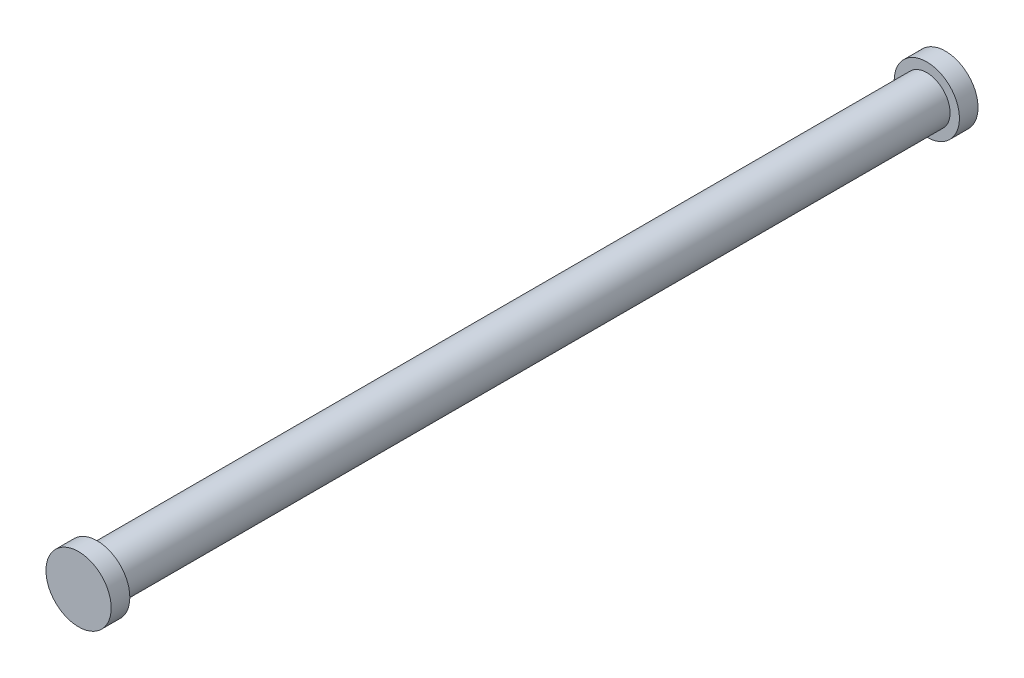
ISO-10303-21;
HEADER;
FILE_DESCRIPTION(('STEP AP214'),'2;1');
FILE_NAME('part.step','',(''),(''),'','','');
FILE_SCHEMA(('AUTOMOTIVE_DESIGN { 1 0 10303 214 1 1 1 1 }'));
ENDSEC;
DATA;
#1=APPLICATION_CONTEXT('core data for automotive mechanical design processes');
#2=APPLICATION_PROTOCOL_DEFINITION('international standard','automotive_design',2000,#1);
#3=PRODUCT_CONTEXT('',#1,'mechanical');
#4=PRODUCT('Part','Part','',(#3));
#5=PRODUCT_RELATED_PRODUCT_CATEGORY('part','',(#4));
#6=PRODUCT_DEFINITION_FORMATION('','',#4);
#7=PRODUCT_DEFINITION_CONTEXT('part definition',#1,'design');
#8=PRODUCT_DEFINITION('design','',#6,#7);
#9=PRODUCT_DEFINITION_SHAPE('','',#8);
#10=(LENGTH_UNIT() NAMED_UNIT(*) SI_UNIT(.MILLI.,.METRE.));
#11=(NAMED_UNIT(*) PLANE_ANGLE_UNIT() SI_UNIT($,.RADIAN.));
#12=(NAMED_UNIT(*) SI_UNIT($,.STERADIAN.) SOLID_ANGLE_UNIT());
#13=UNCERTAINTY_MEASURE_WITH_UNIT(LENGTH_MEASURE(1.E-05),#10,'distance_accuracy_value','');
#14=(GEOMETRIC_REPRESENTATION_CONTEXT(3) GLOBAL_UNCERTAINTY_ASSIGNED_CONTEXT((#13)) GLOBAL_UNIT_ASSIGNED_CONTEXT((#10,
#11,#12)) REPRESENTATION_CONTEXT('',''));
#15=CARTESIAN_POINT('',(0.,0.,0.));
#16=DIRECTION('',(0.,0.,1.));
#17=DIRECTION('',(1.,0.,0.));
#18=AXIS2_PLACEMENT_3D('',#15,#16,#17);
#19=CARTESIAN_POINT('',(0.,0.,89.));
#20=DIRECTION('',(0.,0.,-1.));
#21=DIRECTION('',(-1.,0.,0.));
#22=AXIS2_PLACEMENT_3D('',#19,#20,#21);
#23=CYLINDRICAL_SURFACE('',#22,2.5);
#24=CARTESIAN_POINT('',(0.,0.,89.));
#25=DIRECTION('',(0.,0.,1.));
#26=DIRECTION('',(1.,0.,0.));
#27=AXIS2_PLACEMENT_3D('',#24,#25,#26);
#28=CIRCLE('',#27,2.5);
#29=CARTESIAN_POINT('',(2.5,0.,89.));
#30=VERTEX_POINT('',#29);
#31=EDGE_CURVE('E10',#30,#30,#28,.T.);
#32=ORIENTED_EDGE('',*,*,#31,.F.);
#33=EDGE_LOOP('',(#32));
#34=FACE_BOUND('',#33,.T.);
#35=CARTESIAN_POINT('',(0.,0.,0.));
#36=DIRECTION('',(0.,0.,1.));
#37=DIRECTION('',(1.,0.,0.));
#38=AXIS2_PLACEMENT_3D('',#35,#36,#37);
#39=CIRCLE('',#38,2.5);
#40=CARTESIAN_POINT('',(2.5,0.,0.));
#41=VERTEX_POINT('',#40);
#42=EDGE_CURVE('E40',#41,#41,#39,.T.);
#43=ORIENTED_EDGE('',*,*,#42,.T.);
#44=EDGE_LOOP('',(#43));
#45=FACE_BOUND('',#44,.T.);
#46=ADVANCED_FACE('F37',(#34,#45),#23,.T.);
#47=CARTESIAN_POINT('',(0.,0.,-2.));
#48=DIRECTION('',(0.,0.,1.));
#49=DIRECTION('',(1.,0.,0.));
#50=AXIS2_PLACEMENT_3D('',#47,#48,#49);
#51=CYLINDRICAL_SURFACE('',#50,3.5);
#52=CARTESIAN_POINT('',(0.,0.,-2.));
#53=DIRECTION('',(0.,0.,-1.));
#54=DIRECTION('',(-1.,0.,0.));
#55=AXIS2_PLACEMENT_3D('',#52,#53,#54);
#56=CIRCLE('',#55,3.5);
#57=CARTESIAN_POINT('',(-3.5,0.,-2.));
#58=VERTEX_POINT('',#57);
#59=EDGE_CURVE('E49',#58,#58,#56,.T.);
#60=ORIENTED_EDGE('',*,*,#59,.F.);
#61=EDGE_LOOP('',(#60));
#62=FACE_BOUND('',#61,.T.);
#63=CARTESIAN_POINT('',(0.,0.,0.));
#64=DIRECTION('',(0.,0.,-1.));
#65=DIRECTION('',(-1.,0.,0.));
#66=AXIS2_PLACEMENT_3D('',#63,#64,#65);
#67=CIRCLE('',#66,3.5);
#68=CARTESIAN_POINT('',(-3.5,0.,0.));
#69=VERTEX_POINT('',#68);
#70=EDGE_CURVE('E51',#69,#69,#67,.T.);
#71=ORIENTED_EDGE('',*,*,#70,.T.);
#72=EDGE_LOOP('',(#71));
#73=FACE_BOUND('',#72,.T.);
#74=ADVANCED_FACE('F84',(#62,#73),#51,.T.);
#75=CARTESIAN_POINT('',(0.,0.,-2.));
#76=DIRECTION('',(0.,0.,-1.));
#77=DIRECTION('',(-1.,0.,0.));
#78=AXIS2_PLACEMENT_3D('',#75,#76,#77);
#79=PLANE('',#78);
#80=ORIENTED_EDGE('',*,*,#59,.T.);
#81=EDGE_LOOP('',(#80));
#82=FACE_BOUND('',#81,.T.);
#83=ADVANCED_FACE('F89',(#82),#79,.T.);
#84=CARTESIAN_POINT('',(0.,0.,0.));
#85=DIRECTION('',(0.,0.,-1.));
#86=DIRECTION('',(-1.,0.,0.));
#87=AXIS2_PLACEMENT_3D('',#84,#85,#86);
#88=PLANE('',#87);
#89=ORIENTED_EDGE('',*,*,#42,.F.);
#90=EDGE_LOOP('',(#89));
#91=FACE_BOUND('',#90,.T.);
#92=ORIENTED_EDGE('',*,*,#70,.F.);
#93=EDGE_LOOP('',(#92));
#94=FACE_BOUND('',#93,.T.);
#95=ADVANCED_FACE('F72',(#91,#94),#88,.F.);
#96=CARTESIAN_POINT('',(0.,0.,91.));
#97=DIRECTION('',(0.,0.,-1.));
#98=DIRECTION('',(-1.,0.,0.));
#99=AXIS2_PLACEMENT_3D('',#96,#97,#98);
#100=CYLINDRICAL_SURFACE('',#99,3.5);
#101=CARTESIAN_POINT('',(0.,0.,91.));
#102=DIRECTION('',(0.,0.,1.));
#103=DIRECTION('',(1.,0.,0.));
#104=AXIS2_PLACEMENT_3D('',#101,#102,#103);
#105=CIRCLE('',#104,3.5);
#106=CARTESIAN_POINT('',(3.5,0.,91.));
#107=VERTEX_POINT('',#106);
#108=EDGE_CURVE('E55',#107,#107,#105,.T.);
#109=ORIENTED_EDGE('',*,*,#108,.F.);
#110=EDGE_LOOP('',(#109));
#111=FACE_BOUND('',#110,.T.);
#112=CARTESIAN_POINT('',(0.,0.,89.));
#113=DIRECTION('',(0.,0.,1.));
#114=DIRECTION('',(1.,0.,0.));
#115=AXIS2_PLACEMENT_3D('',#112,#113,#114);
#116=CIRCLE('',#115,3.5);
#117=CARTESIAN_POINT('',(3.5,0.,89.));
#118=VERTEX_POINT('',#117);
#119=EDGE_CURVE('E59',#118,#118,#116,.T.);
#120=ORIENTED_EDGE('',*,*,#119,.T.);
#121=EDGE_LOOP('',(#120));
#122=FACE_BOUND('',#121,.T.);
#123=ADVANCED_FACE('F69',(#111,#122),#100,.T.);
#124=CARTESIAN_POINT('',(0.,0.,91.));
#125=DIRECTION('',(0.,0.,1.));
#126=DIRECTION('',(1.,0.,0.));
#127=AXIS2_PLACEMENT_3D('',#124,#125,#126);
#128=PLANE('',#127);
#129=ORIENTED_EDGE('',*,*,#108,.T.);
#130=EDGE_LOOP('',(#129));
#131=FACE_BOUND('',#130,.T.);
#132=ADVANCED_FACE('F67',(#131),#128,.T.);
#133=CARTESIAN_POINT('',(0.,0.,89.));
#134=DIRECTION('',(0.,0.,1.));
#135=DIRECTION('',(1.,0.,0.));
#136=AXIS2_PLACEMENT_3D('',#133,#134,#135);
#137=PLANE('',#136);
#138=ORIENTED_EDGE('',*,*,#31,.T.);
#139=EDGE_LOOP('',(#138));
#140=FACE_BOUND('',#139,.T.);
#141=ORIENTED_EDGE('',*,*,#119,.F.);
#142=EDGE_LOOP('',(#141));
#143=FACE_BOUND('',#142,.T.);
#144=ADVANCED_FACE('F76',(#140,#143),#137,.F.);
#145=CLOSED_SHELL('',(#46,#74,#83,#95,#123,#132,#144));
#146=MANIFOLD_SOLID_BREP('B2',#145);
#147=ADVANCED_BREP_SHAPE_REPRESENTATION('',(#18,#146),#14);
#148=SHAPE_DEFINITION_REPRESENTATION(#9,#147);
ENDSEC;
END-ISO-10303-21;
